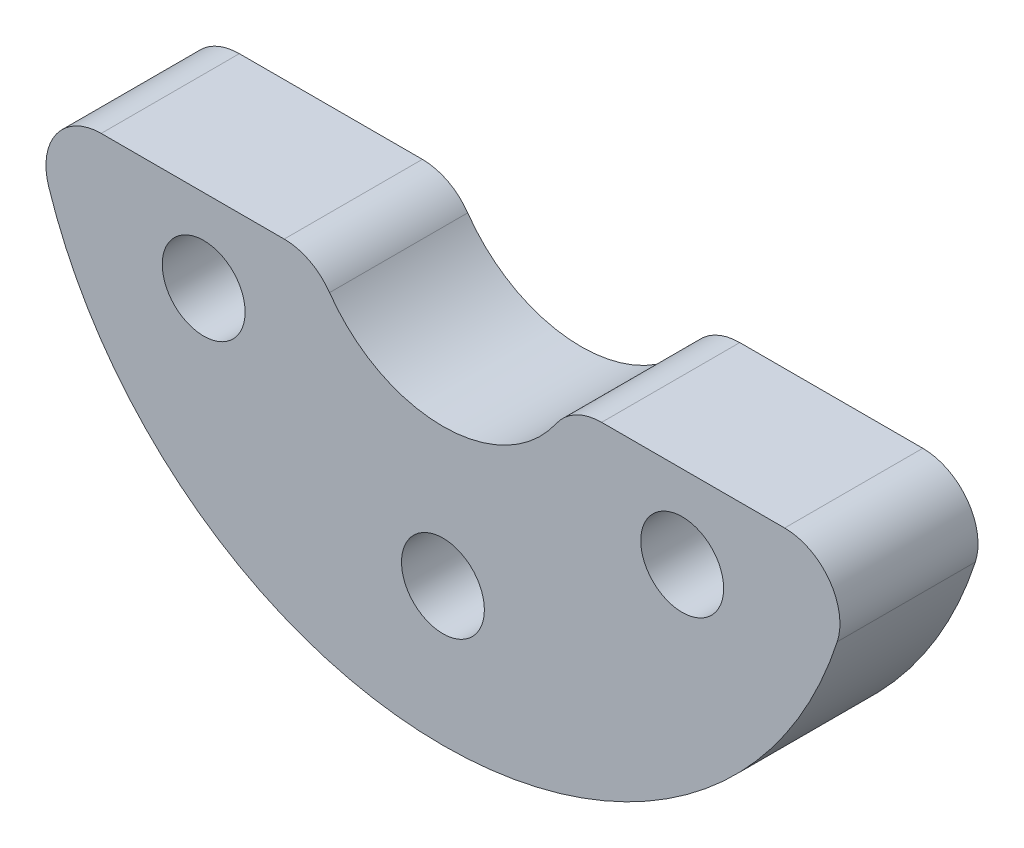
ISO-10303-21;
HEADER;
FILE_DESCRIPTION(('STEP AP214'),'2;1');
FILE_NAME('part.step','',(''),(''),'','','');
FILE_SCHEMA(('AUTOMOTIVE_DESIGN { 1 0 10303 214 1 1 1 1 }'));
ENDSEC;
DATA;
#1=APPLICATION_CONTEXT('core data for automotive mechanical design processes');
#2=APPLICATION_PROTOCOL_DEFINITION('international standard','automotive_design',2000,#1);
#3=PRODUCT_CONTEXT('',#1,'mechanical');
#4=PRODUCT('Part','Part','',(#3));
#5=PRODUCT_RELATED_PRODUCT_CATEGORY('part','',(#4));
#6=PRODUCT_DEFINITION_FORMATION('','',#4);
#7=PRODUCT_DEFINITION_CONTEXT('part definition',#1,'design');
#8=PRODUCT_DEFINITION('design','',#6,#7);
#9=PRODUCT_DEFINITION_SHAPE('','',#8);
#10=(LENGTH_UNIT() NAMED_UNIT(*) SI_UNIT(.MILLI.,.METRE.));
#11=(NAMED_UNIT(*) PLANE_ANGLE_UNIT() SI_UNIT($,.RADIAN.));
#12=(NAMED_UNIT(*) SI_UNIT($,.STERADIAN.) SOLID_ANGLE_UNIT());
#13=UNCERTAINTY_MEASURE_WITH_UNIT(LENGTH_MEASURE(1.E-05),#10,'distance_accuracy_value','');
#14=(GEOMETRIC_REPRESENTATION_CONTEXT(3) GLOBAL_UNCERTAINTY_ASSIGNED_CONTEXT((#13)) GLOBAL_UNIT_ASSIGNED_CONTEXT((#10,
#11,#12)) REPRESENTATION_CONTEXT('',''));
#15=CARTESIAN_POINT('',(0.,0.,0.));
#16=DIRECTION('',(0.,0.,1.));
#17=DIRECTION('',(1.,0.,0.));
#18=AXIS2_PLACEMENT_3D('',#15,#16,#17);
#19=CARTESIAN_POINT('',(0.,0.,5.));
#20=DIRECTION('',(0.,0.,1.));
#21=DIRECTION('',(1.,0.,0.));
#22=AXIS2_PLACEMENT_3D('',#19,#20,#21);
#23=PLANE('',#22);
#24=CARTESIAN_POINT('',(0.,0.,5.));
#25=DIRECTION('',(0.,0.,1.));
#26=DIRECTION('',(1.,0.,0.));
#27=AXIS2_PLACEMENT_3D('',#24,#25,#26);
#28=CIRCLE('',#27,15.);
#29=CARTESIAN_POINT('',(-14.2722887040611,-4.61538461538462,5.));
#30=VERTEX_POINT('',#29);
#31=CARTESIAN_POINT('',(14.2722887040611,-4.61538461538462,5.));
#32=VERTEX_POINT('',#31);
#33=EDGE_CURVE('E106',#30,#32,#28,.T.);
#34=ORIENTED_EDGE('',*,*,#33,.T.);
#35=CARTESIAN_POINT('',(12.369316876853,-4.,5.));
#36=DIRECTION('',(0.,0.,1.));
#37=DIRECTION('',(1.,0.,0.));
#38=AXIS2_PLACEMENT_3D('',#35,#36,#37);
#39=CIRCLE('',#38,2.);
#40=CARTESIAN_POINT('',(12.369316876853,-2.,5.));
#41=VERTEX_POINT('',#40);
#42=EDGE_CURVE('E157',#32,#41,#39,.T.);
#43=ORIENTED_EDGE('',*,*,#42,.T.);
#44=DIRECTION('',(1.,0.,0.));
#45=VECTOR('',#44,1.);
#46=CARTESIAN_POINT('',(4.58257569495584,-2.,5.));
#47=LINE('',#46,#45);
#48=CARTESIAN_POINT('',(5.74456264653803,-2.,5.));
#49=VERTEX_POINT('',#48);
#50=EDGE_CURVE('E185',#49,#41,#47,.T.);
#51=ORIENTED_EDGE('',*,*,#50,.F.);
#52=CARTESIAN_POINT('',(5.74456264653803,-4.,5.));
#53=DIRECTION('',(0.,0.,1.));
#54=DIRECTION('',(1.,0.,0.));
#55=AXIS2_PLACEMENT_3D('',#52,#53,#54);
#56=CIRCLE('',#55,2.);
#57=CARTESIAN_POINT('',(4.10325903324145,-2.85714285714286,5.));
#58=VERTEX_POINT('',#57);
#59=EDGE_CURVE('E153',#49,#58,#56,.T.);
#60=ORIENTED_EDGE('',*,*,#59,.T.);
#61=CARTESIAN_POINT('',(0.,0.,5.));
#62=DIRECTION('',(0.,0.,1.));
#63=DIRECTION('',(1.,0.,0.));
#64=AXIS2_PLACEMENT_3D('',#61,#62,#63);
#65=CIRCLE('',#64,5.);
#66=CARTESIAN_POINT('',(-4.10325903324145,-2.85714285714286,5.));
#67=VERTEX_POINT('',#66);
#68=EDGE_CURVE('E141',#67,#58,#65,.T.);
#69=ORIENTED_EDGE('',*,*,#68,.F.);
#70=CARTESIAN_POINT('',(-5.74456264653803,-4.,5.));
#71=DIRECTION('',(0.,0.,1.));
#72=DIRECTION('',(1.,0.,0.));
#73=AXIS2_PLACEMENT_3D('',#70,#71,#72);
#74=CIRCLE('',#73,2.);
#75=CARTESIAN_POINT('',(-5.74456264653803,-2.,5.));
#76=VERTEX_POINT('',#75);
#77=EDGE_CURVE('E164',#67,#76,#74,.T.);
#78=ORIENTED_EDGE('',*,*,#77,.T.);
#79=DIRECTION('',(1.,0.,0.));
#80=VECTOR('',#79,1.);
#81=CARTESIAN_POINT('',(-4.58257569495584,-2.,5.));
#82=LINE('',#81,#80);
#83=CARTESIAN_POINT('',(-12.369316876853,-2.,5.));
#84=VERTEX_POINT('',#83);
#85=EDGE_CURVE('E188',#84,#76,#82,.T.);
#86=ORIENTED_EDGE('',*,*,#85,.F.);
#87=CARTESIAN_POINT('',(-12.369316876853,-4.,5.));
#88=DIRECTION('',(0.,0.,1.));
#89=DIRECTION('',(1.,0.,0.));
#90=AXIS2_PLACEMENT_3D('',#87,#88,#89);
#91=CIRCLE('',#90,2.);
#92=EDGE_CURVE('E162',#84,#30,#91,.T.);
#93=ORIENTED_EDGE('',*,*,#92,.T.);
#94=EDGE_LOOP('',(#34,#43,#51,#60,#69,#78,#86,#93));
#95=FACE_BOUND('',#94,.T.);
#96=CARTESIAN_POINT('',(-8.66025403784443,-4.99999999999992,5.));
#97=DIRECTION('',(0.,0.,1.));
#98=DIRECTION('',(1.,0.,0.));
#99=AXIS2_PLACEMENT_3D('',#96,#97,#98);
#100=CIRCLE('',#99,1.5);
#101=CARTESIAN_POINT('',(-7.16025403784443,-4.99999999999992,5.));
#102=VERTEX_POINT('',#101);
#103=EDGE_CURVE('E177',#102,#102,#100,.T.);
#104=ORIENTED_EDGE('',*,*,#103,.F.);
#105=EDGE_LOOP('',(#104));
#106=FACE_BOUND('',#105,.T.);
#107=CARTESIAN_POINT('',(8.66025403784437,-5.00000000000004,5.));
#108=DIRECTION('',(0.,0.,1.));
#109=DIRECTION('',(1.,0.,0.));
#110=AXIS2_PLACEMENT_3D('',#107,#108,#109);
#111=CIRCLE('',#110,1.5);
#112=CARTESIAN_POINT('',(10.1602540378444,-5.00000000000004,5.));
#113=VERTEX_POINT('',#112);
#114=EDGE_CURVE('E115',#113,#113,#111,.T.);
#115=ORIENTED_EDGE('',*,*,#114,.F.);
#116=EDGE_LOOP('',(#115));
#117=FACE_BOUND('',#116,.T.);
#118=CARTESIAN_POINT('',(0.,-10.,5.));
#119=DIRECTION('',(0.,0.,1.));
#120=DIRECTION('',(1.,0.,0.));
#121=AXIS2_PLACEMENT_3D('',#118,#119,#120);
#122=CIRCLE('',#121,1.5);
#123=CARTESIAN_POINT('',(1.49999999999993,-10.,5.));
#124=VERTEX_POINT('',#123);
#125=EDGE_CURVE('E171',#124,#124,#122,.T.);
#126=ORIENTED_EDGE('',*,*,#125,.F.);
#127=EDGE_LOOP('',(#126));
#128=FACE_BOUND('',#127,.T.);
#129=ADVANCED_FACE('F33',(#95,#106,#117,#128),#23,.T.);
#130=CARTESIAN_POINT('',(0.,0.,0.));
#131=DIRECTION('',(0.,0.,1.));
#132=DIRECTION('',(1.,0.,0.));
#133=AXIS2_PLACEMENT_3D('',#130,#131,#132);
#134=PLANE('',#133);
#135=DIRECTION('',(1.,0.,0.));
#136=VECTOR('',#135,1.);
#137=CARTESIAN_POINT('',(4.58257569495584,-2.,0.));
#138=LINE('',#137,#136);
#139=CARTESIAN_POINT('',(5.74456264653803,-2.,0.));
#140=VERTEX_POINT('',#139);
#141=CARTESIAN_POINT('',(12.369316876853,-2.,0.));
#142=VERTEX_POINT('',#141);
#143=EDGE_CURVE('E146',#140,#142,#138,.T.);
#144=ORIENTED_EDGE('',*,*,#143,.T.);
#145=CARTESIAN_POINT('',(12.369316876853,-4.,0.));
#146=DIRECTION('',(0.,0.,1.));
#147=DIRECTION('',(1.,0.,0.));
#148=AXIS2_PLACEMENT_3D('',#145,#146,#147);
#149=CIRCLE('',#148,2.);
#150=CARTESIAN_POINT('',(14.2722887040611,-4.61538461538462,0.));
#151=VERTEX_POINT('',#150);
#152=EDGE_CURVE('E114',#142,#151,#149,.F.);
#153=ORIENTED_EDGE('',*,*,#152,.T.);
#154=CARTESIAN_POINT('',(0.,0.,0.));
#155=DIRECTION('',(0.,0.,1.));
#156=DIRECTION('',(1.,0.,0.));
#157=AXIS2_PLACEMENT_3D('',#154,#155,#156);
#158=CIRCLE('',#157,15.);
#159=CARTESIAN_POINT('',(-14.2722887040611,-4.61538461538462,0.));
#160=VERTEX_POINT('',#159);
#161=EDGE_CURVE('E103',#160,#151,#158,.T.);
#162=ORIENTED_EDGE('',*,*,#161,.F.);
#163=CARTESIAN_POINT('',(-12.369316876853,-4.,0.));
#164=DIRECTION('',(0.,0.,1.));
#165=DIRECTION('',(1.,0.,0.));
#166=AXIS2_PLACEMENT_3D('',#163,#164,#165);
#167=CIRCLE('',#166,2.);
#168=CARTESIAN_POINT('',(-12.369316876853,-2.,0.));
#169=VERTEX_POINT('',#168);
#170=EDGE_CURVE('E54',#160,#169,#167,.F.);
#171=ORIENTED_EDGE('',*,*,#170,.T.);
#172=DIRECTION('',(1.,0.,0.));
#173=VECTOR('',#172,1.);
#174=CARTESIAN_POINT('',(-4.58257569495584,-2.,0.));
#175=LINE('',#174,#173);
#176=CARTESIAN_POINT('',(-5.74456264653803,-2.,0.));
#177=VERTEX_POINT('',#176);
#178=EDGE_CURVE('E147',#169,#177,#175,.T.);
#179=ORIENTED_EDGE('',*,*,#178,.T.);
#180=CARTESIAN_POINT('',(-5.74456264653803,-4.,0.));
#181=DIRECTION('',(0.,0.,1.));
#182=DIRECTION('',(1.,0.,0.));
#183=AXIS2_PLACEMENT_3D('',#180,#181,#182);
#184=CIRCLE('',#183,2.);
#185=CARTESIAN_POINT('',(-4.10325903324145,-2.85714285714286,0.));
#186=VERTEX_POINT('',#185);
#187=EDGE_CURVE('E120',#177,#186,#184,.F.);
#188=ORIENTED_EDGE('',*,*,#187,.T.);
#189=CARTESIAN_POINT('',(0.,0.,0.));
#190=DIRECTION('',(0.,0.,1.));
#191=DIRECTION('',(1.,0.,0.));
#192=AXIS2_PLACEMENT_3D('',#189,#190,#191);
#193=CIRCLE('',#192,5.);
#194=CARTESIAN_POINT('',(4.10325903324145,-2.85714285714286,0.));
#195=VERTEX_POINT('',#194);
#196=EDGE_CURVE('E138',#186,#195,#193,.T.);
#197=ORIENTED_EDGE('',*,*,#196,.T.);
#198=CARTESIAN_POINT('',(5.74456264653803,-4.,0.));
#199=DIRECTION('',(0.,0.,1.));
#200=DIRECTION('',(1.,0.,0.));
#201=AXIS2_PLACEMENT_3D('',#198,#199,#200);
#202=CIRCLE('',#201,2.);
#203=EDGE_CURVE('E119',#195,#140,#202,.F.);
#204=ORIENTED_EDGE('',*,*,#203,.T.);
#205=EDGE_LOOP('',(#144,#153,#162,#171,#179,#188,#197,#204));
#206=FACE_BOUND('',#205,.T.);
#207=CARTESIAN_POINT('',(8.66025403784437,-5.00000000000004,0.));
#208=DIRECTION('',(0.,0.,1.));
#209=DIRECTION('',(1.,0.,0.));
#210=AXIS2_PLACEMENT_3D('',#207,#208,#209);
#211=CIRCLE('',#210,1.5);
#212=CARTESIAN_POINT('',(10.1602540378444,-5.00000000000004,0.));
#213=VERTEX_POINT('',#212);
#214=EDGE_CURVE('E168',#213,#213,#211,.T.);
#215=ORIENTED_EDGE('',*,*,#214,.T.);
#216=EDGE_LOOP('',(#215));
#217=FACE_BOUND('',#216,.T.);
#218=CARTESIAN_POINT('',(0.,-10.,0.));
#219=DIRECTION('',(0.,0.,1.));
#220=DIRECTION('',(1.,0.,0.));
#221=AXIS2_PLACEMENT_3D('',#218,#219,#220);
#222=CIRCLE('',#221,1.5);
#223=CARTESIAN_POINT('',(1.49999999999993,-10.,0.));
#224=VERTEX_POINT('',#223);
#225=EDGE_CURVE('E174',#224,#224,#222,.T.);
#226=ORIENTED_EDGE('',*,*,#225,.T.);
#227=EDGE_LOOP('',(#226));
#228=FACE_BOUND('',#227,.T.);
#229=CARTESIAN_POINT('',(-8.66025403784443,-4.99999999999992,0.));
#230=DIRECTION('',(0.,0.,1.));
#231=DIRECTION('',(1.,0.,0.));
#232=AXIS2_PLACEMENT_3D('',#229,#230,#231);
#233=CIRCLE('',#232,1.5);
#234=CARTESIAN_POINT('',(-7.16025403784443,-4.99999999999992,0.));
#235=VERTEX_POINT('',#234);
#236=EDGE_CURVE('E180',#235,#235,#233,.T.);
#237=ORIENTED_EDGE('',*,*,#236,.T.);
#238=EDGE_LOOP('',(#237));
#239=FACE_BOUND('',#238,.T.);
#240=ADVANCED_FACE('F111',(#206,#217,#228,#239),#134,.F.);
#241=CARTESIAN_POINT('',(0.,0.,5.));
#242=DIRECTION('',(0.,0.,-1.));
#243=DIRECTION('',(-1.,0.,0.));
#244=AXIS2_PLACEMENT_3D('',#241,#242,#243);
#245=CYLINDRICAL_SURFACE('',#244,15.);
#246=ORIENTED_EDGE('',*,*,#161,.T.);
#247=DIRECTION('',(0.,0.,-1.));
#248=VECTOR('',#247,1.);
#249=CARTESIAN_POINT('',(14.2722887040611,-4.61538461538462,5.));
#250=LINE('',#249,#248);
#251=EDGE_CURVE('E108',#151,#32,#250,.F.);
#252=ORIENTED_EDGE('',*,*,#251,.T.);
#253=ORIENTED_EDGE('',*,*,#33,.F.);
#254=DIRECTION('',(0.,0.,-1.));
#255=VECTOR('',#254,1.);
#256=CARTESIAN_POINT('',(-14.2722887040611,-4.61538461538462,5.));
#257=LINE('',#256,#255);
#258=EDGE_CURVE('E100',#30,#160,#257,.T.);
#259=ORIENTED_EDGE('',*,*,#258,.T.);
#260=EDGE_LOOP('',(#246,#252,#253,#259));
#261=FACE_BOUND('',#260,.T.);
#262=ADVANCED_FACE('F101',(#261),#245,.T.);
#263=CARTESIAN_POINT('',(8.66025403784437,-5.00000000000004,5.));
#264=DIRECTION('',(0.,0.,-1.));
#265=DIRECTION('',(-1.,0.,0.));
#266=AXIS2_PLACEMENT_3D('',#263,#264,#265);
#267=CYLINDRICAL_SURFACE('',#266,1.5);
#268=ORIENTED_EDGE('',*,*,#114,.T.);
#269=EDGE_LOOP('',(#268));
#270=FACE_BOUND('',#269,.T.);
#271=ORIENTED_EDGE('',*,*,#214,.F.);
#272=EDGE_LOOP('',(#271));
#273=FACE_BOUND('',#272,.T.);
#274=ADVANCED_FACE('F216',(#270,#273),#267,.F.);
#275=CARTESIAN_POINT('',(0.,-10.,5.));
#276=DIRECTION('',(0.,0.,-1.));
#277=DIRECTION('',(-1.,0.,0.));
#278=AXIS2_PLACEMENT_3D('',#275,#276,#277);
#279=CYLINDRICAL_SURFACE('',#278,1.5);
#280=ORIENTED_EDGE('',*,*,#125,.T.);
#281=EDGE_LOOP('',(#280));
#282=FACE_BOUND('',#281,.T.);
#283=ORIENTED_EDGE('',*,*,#225,.F.);
#284=EDGE_LOOP('',(#283));
#285=FACE_BOUND('',#284,.T.);
#286=ADVANCED_FACE('F290',(#282,#285),#279,.F.);
#287=CARTESIAN_POINT('',(-8.66025403784443,-4.99999999999992,5.));
#288=DIRECTION('',(0.,0.,-1.));
#289=DIRECTION('',(-1.,0.,0.));
#290=AXIS2_PLACEMENT_3D('',#287,#288,#289);
#291=CYLINDRICAL_SURFACE('',#290,1.5);
#292=ORIENTED_EDGE('',*,*,#103,.T.);
#293=EDGE_LOOP('',(#292));
#294=FACE_BOUND('',#293,.T.);
#295=ORIENTED_EDGE('',*,*,#236,.F.);
#296=EDGE_LOOP('',(#295));
#297=FACE_BOUND('',#296,.T.);
#298=ADVANCED_FACE('F263',(#294,#297),#291,.F.);
#299=CARTESIAN_POINT('',(4.58257569495584,-2.,0.));
#300=DIRECTION('',(0.,-1.,0.));
#301=DIRECTION('',(1.,0.,0.));
#302=AXIS2_PLACEMENT_3D('',#299,#300,#301);
#303=PLANE('',#302);
#304=ORIENTED_EDGE('',*,*,#50,.T.);
#305=DIRECTION('',(0.,0.,-1.));
#306=VECTOR('',#305,1.);
#307=CARTESIAN_POINT('',(12.369316876853,-2.,0.));
#308=LINE('',#307,#306);
#309=EDGE_CURVE('E123',#41,#142,#308,.T.);
#310=ORIENTED_EDGE('',*,*,#309,.T.);
#311=ORIENTED_EDGE('',*,*,#143,.F.);
#312=DIRECTION('',(0.,0.,1.));
#313=VECTOR('',#312,1.);
#314=CARTESIAN_POINT('',(5.74456264653803,-2.,0.));
#315=LINE('',#314,#313);
#316=EDGE_CURVE('E152',#140,#49,#315,.T.);
#317=ORIENTED_EDGE('',*,*,#316,.T.);
#318=EDGE_LOOP('',(#304,#310,#311,#317));
#319=FACE_BOUND('',#318,.T.);
#320=ADVANCED_FACE('F196',(#319),#303,.F.);
#321=CARTESIAN_POINT('',(0.,0.,0.));
#322=DIRECTION('',(0.,0.,1.));
#323=DIRECTION('',(1.,0.,0.));
#324=AXIS2_PLACEMENT_3D('',#321,#322,#323);
#325=CYLINDRICAL_SURFACE('',#324,5.);
#326=ORIENTED_EDGE('',*,*,#68,.T.);
#327=DIRECTION('',(0.,0.,1.));
#328=VECTOR('',#327,1.);
#329=CARTESIAN_POINT('',(4.10325903324145,-2.85714285714286,0.));
#330=LINE('',#329,#328);
#331=EDGE_CURVE('E131',#58,#195,#330,.F.);
#332=ORIENTED_EDGE('',*,*,#331,.T.);
#333=ORIENTED_EDGE('',*,*,#196,.F.);
#334=DIRECTION('',(0.,0.,1.));
#335=VECTOR('',#334,1.);
#336=CARTESIAN_POINT('',(-4.10325903324145,-2.85714285714286,0.));
#337=LINE('',#336,#335);
#338=EDGE_CURVE('E128',#186,#67,#337,.T.);
#339=ORIENTED_EDGE('',*,*,#338,.T.);
#340=EDGE_LOOP('',(#326,#332,#333,#339));
#341=FACE_BOUND('',#340,.T.);
#342=ADVANCED_FACE('F137',(#341),#325,.F.);
#343=CARTESIAN_POINT('',(-4.58257569495584,-2.,0.));
#344=DIRECTION('',(0.,-1.,0.));
#345=DIRECTION('',(1.,0.,0.));
#346=AXIS2_PLACEMENT_3D('',#343,#344,#345);
#347=PLANE('',#346);
#348=ORIENTED_EDGE('',*,*,#178,.F.);
#349=DIRECTION('',(0.,0.,-1.));
#350=VECTOR('',#349,1.);
#351=CARTESIAN_POINT('',(-12.369316876853,-2.,0.));
#352=LINE('',#351,#350);
#353=EDGE_CURVE('E11',#169,#84,#352,.F.);
#354=ORIENTED_EDGE('',*,*,#353,.T.);
#355=ORIENTED_EDGE('',*,*,#85,.T.);
#356=DIRECTION('',(0.,0.,1.));
#357=VECTOR('',#356,1.);
#358=CARTESIAN_POINT('',(-5.74456264653803,-2.,0.));
#359=LINE('',#358,#357);
#360=EDGE_CURVE('E41',#76,#177,#359,.F.);
#361=ORIENTED_EDGE('',*,*,#360,.T.);
#362=EDGE_LOOP('',(#348,#354,#355,#361));
#363=FACE_BOUND('',#362,.T.);
#364=ADVANCED_FACE('F199',(#363),#347,.F.);
#365=CARTESIAN_POINT('',(12.369316876853,-4.,5.));
#366=DIRECTION('',(0.,0.,-1.));
#367=DIRECTION('',(-1.,0.,0.));
#368=AXIS2_PLACEMENT_3D('',#365,#366,#367);
#369=CYLINDRICAL_SURFACE('',#368,2.);
#370=ORIENTED_EDGE('',*,*,#152,.F.);
#371=ORIENTED_EDGE('',*,*,#309,.F.);
#372=ORIENTED_EDGE('',*,*,#42,.F.);
#373=ORIENTED_EDGE('',*,*,#251,.F.);
#374=EDGE_LOOP('',(#370,#371,#372,#373));
#375=FACE_BOUND('',#374,.T.);
#376=ADVANCED_FACE('F198',(#375),#369,.T.);
#377=CARTESIAN_POINT('',(5.74456264653803,-4.,0.));
#378=DIRECTION('',(0.,0.,1.));
#379=DIRECTION('',(1.,0.,0.));
#380=AXIS2_PLACEMENT_3D('',#377,#378,#379);
#381=CYLINDRICAL_SURFACE('',#380,2.);
#382=ORIENTED_EDGE('',*,*,#203,.F.);
#383=ORIENTED_EDGE('',*,*,#331,.F.);
#384=ORIENTED_EDGE('',*,*,#59,.F.);
#385=ORIENTED_EDGE('',*,*,#316,.F.);
#386=EDGE_LOOP('',(#382,#383,#384,#385));
#387=FACE_BOUND('',#386,.T.);
#388=ADVANCED_FACE('F150',(#387),#381,.T.);
#389=CARTESIAN_POINT('',(-12.369316876853,-4.,5.));
#390=DIRECTION('',(0.,0.,-1.));
#391=DIRECTION('',(-1.,0.,0.));
#392=AXIS2_PLACEMENT_3D('',#389,#390,#391);
#393=CYLINDRICAL_SURFACE('',#392,2.);
#394=ORIENTED_EDGE('',*,*,#170,.F.);
#395=ORIENTED_EDGE('',*,*,#258,.F.);
#396=ORIENTED_EDGE('',*,*,#92,.F.);
#397=ORIENTED_EDGE('',*,*,#353,.F.);
#398=EDGE_LOOP('',(#394,#395,#396,#397));
#399=FACE_BOUND('',#398,.T.);
#400=ADVANCED_FACE('F118',(#399),#393,.T.);
#401=CARTESIAN_POINT('',(-5.74456264653803,-4.,0.));
#402=DIRECTION('',(0.,0.,1.));
#403=DIRECTION('',(1.,0.,0.));
#404=AXIS2_PLACEMENT_3D('',#401,#402,#403);
#405=CYLINDRICAL_SURFACE('',#404,2.);
#406=ORIENTED_EDGE('',*,*,#187,.F.);
#407=ORIENTED_EDGE('',*,*,#360,.F.);
#408=ORIENTED_EDGE('',*,*,#77,.F.);
#409=ORIENTED_EDGE('',*,*,#338,.F.);
#410=EDGE_LOOP('',(#406,#407,#408,#409));
#411=FACE_BOUND('',#410,.T.);
#412=ADVANCED_FACE('F35',(#411),#405,.T.);
#413=CLOSED_SHELL('',(#129,#240,#262,#274,#286,#298,#320,#342,#364,#376,#388,#400,#412));
#414=MANIFOLD_SOLID_BREP('B2',#413);
#415=ADVANCED_BREP_SHAPE_REPRESENTATION('',(#18,#414),#14);
#416=SHAPE_DEFINITION_REPRESENTATION(#9,#415);
ENDSEC;
END-ISO-10303-21;
